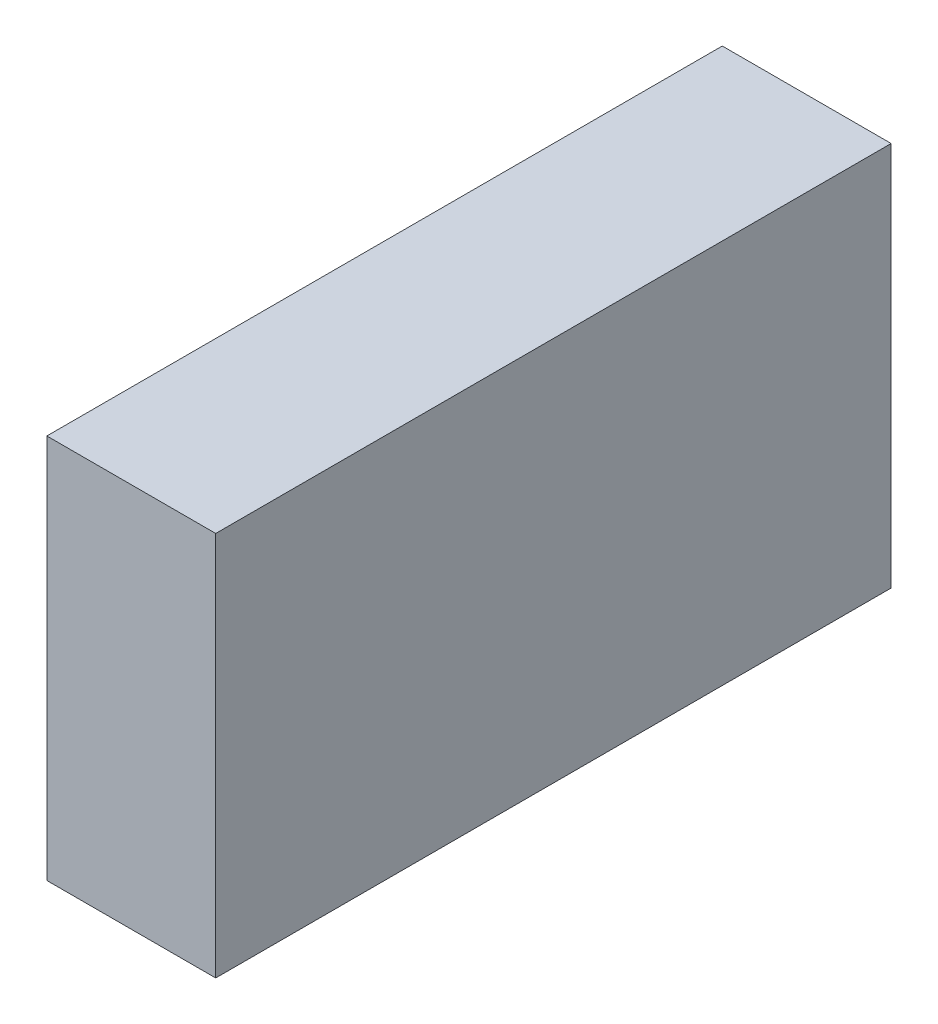
ISO-10303-21;
HEADER;
FILE_DESCRIPTION(('STEP AP214'),'2;1');
FILE_NAME('part.step','',(''),(''),'','','');
FILE_SCHEMA(('AUTOMOTIVE_DESIGN { 1 0 10303 214 1 1 1 1 }'));
ENDSEC;
DATA;
#1=APPLICATION_CONTEXT('core data for automotive mechanical design processes');
#2=APPLICATION_PROTOCOL_DEFINITION('international standard','automotive_design',2000,#1);
#3=PRODUCT_CONTEXT('',#1,'mechanical');
#4=PRODUCT('Part','Part','',(#3));
#5=PRODUCT_RELATED_PRODUCT_CATEGORY('part','',(#4));
#6=PRODUCT_DEFINITION_FORMATION('','',#4);
#7=PRODUCT_DEFINITION_CONTEXT('part definition',#1,'design');
#8=PRODUCT_DEFINITION('design','',#6,#7);
#9=PRODUCT_DEFINITION_SHAPE('','',#8);
#10=(LENGTH_UNIT() NAMED_UNIT(*) SI_UNIT(.MILLI.,.METRE.));
#11=(NAMED_UNIT(*) PLANE_ANGLE_UNIT() SI_UNIT($,.RADIAN.));
#12=(NAMED_UNIT(*) SI_UNIT($,.STERADIAN.) SOLID_ANGLE_UNIT());
#13=UNCERTAINTY_MEASURE_WITH_UNIT(LENGTH_MEASURE(1.E-05),#10,'distance_accuracy_value','');
#14=(GEOMETRIC_REPRESENTATION_CONTEXT(3) GLOBAL_UNCERTAINTY_ASSIGNED_CONTEXT((#13)) GLOBAL_UNIT_ASSIGNED_CONTEXT((#10,
#11,#12)) REPRESENTATION_CONTEXT('',''));
#15=CARTESIAN_POINT('',(0.,0.,0.));
#16=DIRECTION('',(0.,0.,1.));
#17=DIRECTION('',(1.,0.,0.));
#18=AXIS2_PLACEMENT_3D('',#15,#16,#17);
#19=CARTESIAN_POINT('',(0.,0.,200.));
#20=DIRECTION('',(1.,0.,0.));
#21=DIRECTION('',(0.,0.,-1.));
#22=AXIS2_PLACEMENT_3D('',#19,#20,#21);
#23=PLANE('',#22);
#24=DIRECTION('',(0.,-1.,0.));
#25=VECTOR('',#24,1.);
#26=CARTESIAN_POINT('',(0.,0.,0.));
#27=LINE('',#26,#25);
#28=CARTESIAN_POINT('',(0.,114.,0.));
#29=VERTEX_POINT('',#28);
#30=CARTESIAN_POINT('',(0.,0.,0.));
#31=VERTEX_POINT('',#30);
#32=EDGE_CURVE('E98',#29,#31,#27,.T.);
#33=ORIENTED_EDGE('',*,*,#32,.T.);
#34=DIRECTION('',(0.,0.,-1.));
#35=VECTOR('',#34,1.);
#36=CARTESIAN_POINT('',(0.,0.,200.));
#37=LINE('',#36,#35);
#38=CARTESIAN_POINT('',(0.,0.,200.));
#39=VERTEX_POINT('',#38);
#40=EDGE_CURVE('E11',#39,#31,#37,.T.);
#41=ORIENTED_EDGE('',*,*,#40,.F.);
#42=DIRECTION('',(0.,-1.,0.));
#43=VECTOR('',#42,1.);
#44=CARTESIAN_POINT('',(0.,0.,200.));
#45=LINE('',#44,#43);
#46=CARTESIAN_POINT('',(0.,114.,200.));
#47=VERTEX_POINT('',#46);
#48=EDGE_CURVE('E86',#47,#39,#45,.T.);
#49=ORIENTED_EDGE('',*,*,#48,.F.);
#50=DIRECTION('',(0.,0.,-1.));
#51=VECTOR('',#50,1.);
#52=CARTESIAN_POINT('',(0.,114.,200.));
#53=LINE('',#52,#51);
#54=EDGE_CURVE('E94',#47,#29,#53,.T.);
#55=ORIENTED_EDGE('',*,*,#54,.T.);
#56=EDGE_LOOP('',(#33,#41,#49,#55));
#57=FACE_BOUND('',#56,.T.);
#58=ADVANCED_FACE('F35',(#57),#23,.F.);
#59=CARTESIAN_POINT('',(0.,0.,200.));
#60=DIRECTION('',(0.,1.,0.));
#61=DIRECTION('',(0.,0.,1.));
#62=AXIS2_PLACEMENT_3D('',#59,#60,#61);
#63=PLANE('',#62);
#64=DIRECTION('',(1.,0.,0.));
#65=VECTOR('',#64,1.);
#66=CARTESIAN_POINT('',(0.,0.,0.));
#67=LINE('',#66,#65);
#68=CARTESIAN_POINT('',(50.,0.,0.));
#69=VERTEX_POINT('',#68);
#70=EDGE_CURVE('E90',#31,#69,#67,.T.);
#71=ORIENTED_EDGE('',*,*,#70,.T.);
#72=DIRECTION('',(0.,0.,-1.));
#73=VECTOR('',#72,1.);
#74=CARTESIAN_POINT('',(50.,0.,200.));
#75=LINE('',#74,#73);
#76=CARTESIAN_POINT('',(50.,0.,200.));
#77=VERTEX_POINT('',#76);
#78=EDGE_CURVE('E43',#77,#69,#75,.T.);
#79=ORIENTED_EDGE('',*,*,#78,.F.);
#80=DIRECTION('',(1.,0.,0.));
#81=VECTOR('',#80,1.);
#82=CARTESIAN_POINT('',(0.,0.,200.));
#83=LINE('',#82,#81);
#84=EDGE_CURVE('E81',#39,#77,#83,.T.);
#85=ORIENTED_EDGE('',*,*,#84,.F.);
#86=ORIENTED_EDGE('',*,*,#40,.T.);
#87=EDGE_LOOP('',(#71,#79,#85,#86));
#88=FACE_BOUND('',#87,.T.);
#89=ADVANCED_FACE('F89',(#88),#63,.F.);
#90=CARTESIAN_POINT('',(50.,0.,200.));
#91=DIRECTION('',(-1.,0.,0.));
#92=DIRECTION('',(0.,0.,1.));
#93=AXIS2_PLACEMENT_3D('',#90,#91,#92);
#94=PLANE('',#93);
#95=DIRECTION('',(0.,1.,0.));
#96=VECTOR('',#95,1.);
#97=CARTESIAN_POINT('',(50.,0.,0.));
#98=LINE('',#97,#96);
#99=CARTESIAN_POINT('',(50.,114.,0.));
#100=VERTEX_POINT('',#99);
#101=EDGE_CURVE('E68',#69,#100,#98,.T.);
#102=ORIENTED_EDGE('',*,*,#101,.T.);
#103=DIRECTION('',(0.,0.,-1.));
#104=VECTOR('',#103,1.);
#105=CARTESIAN_POINT('',(50.,114.,200.));
#106=LINE('',#105,#104);
#107=CARTESIAN_POINT('',(50.,114.,200.));
#108=VERTEX_POINT('',#107);
#109=EDGE_CURVE('E91',#108,#100,#106,.T.);
#110=ORIENTED_EDGE('',*,*,#109,.F.);
#111=DIRECTION('',(0.,1.,0.));
#112=VECTOR('',#111,1.);
#113=CARTESIAN_POINT('',(50.,0.,200.));
#114=LINE('',#113,#112);
#115=EDGE_CURVE('E84',#77,#108,#114,.T.);
#116=ORIENTED_EDGE('',*,*,#115,.F.);
#117=ORIENTED_EDGE('',*,*,#78,.T.);
#118=EDGE_LOOP('',(#102,#110,#116,#117));
#119=FACE_BOUND('',#118,.T.);
#120=ADVANCED_FACE('F92',(#119),#94,.F.);
#121=CARTESIAN_POINT('',(0.,114.,200.));
#122=DIRECTION('',(0.,-1.,0.));
#123=DIRECTION('',(0.,0.,-1.));
#124=AXIS2_PLACEMENT_3D('',#121,#122,#123);
#125=PLANE('',#124);
#126=DIRECTION('',(-1.,0.,0.));
#127=VECTOR('',#126,1.);
#128=CARTESIAN_POINT('',(0.,114.,0.));
#129=LINE('',#128,#127);
#130=EDGE_CURVE('E74',#100,#29,#129,.T.);
#131=ORIENTED_EDGE('',*,*,#130,.T.);
#132=ORIENTED_EDGE('',*,*,#54,.F.);
#133=DIRECTION('',(-1.,0.,0.));
#134=VECTOR('',#133,1.);
#135=CARTESIAN_POINT('',(0.,114.,200.));
#136=LINE('',#135,#134);
#137=EDGE_CURVE('E51',#108,#47,#136,.T.);
#138=ORIENTED_EDGE('',*,*,#137,.F.);
#139=ORIENTED_EDGE('',*,*,#109,.T.);
#140=EDGE_LOOP('',(#131,#132,#138,#139));
#141=FACE_BOUND('',#140,.T.);
#142=ADVANCED_FACE('F105',(#141),#125,.F.);
#143=CARTESIAN_POINT('',(0.,0.,200.));
#144=DIRECTION('',(0.,0.,-1.));
#145=DIRECTION('',(-1.,0.,0.));
#146=AXIS2_PLACEMENT_3D('',#143,#144,#145);
#147=PLANE('',#146);
#148=ORIENTED_EDGE('',*,*,#48,.T.);
#149=ORIENTED_EDGE('',*,*,#84,.T.);
#150=ORIENTED_EDGE('',*,*,#115,.T.);
#151=ORIENTED_EDGE('',*,*,#137,.T.);
#152=EDGE_LOOP('',(#148,#149,#150,#151));
#153=FACE_BOUND('',#152,.T.);
#154=ADVANCED_FACE('F82',(#153),#147,.F.);
#155=CARTESIAN_POINT('',(0.,0.,0.));
#156=DIRECTION('',(0.,0.,-1.));
#157=DIRECTION('',(-1.,0.,0.));
#158=AXIS2_PLACEMENT_3D('',#155,#156,#157);
#159=PLANE('',#158);
#160=ORIENTED_EDGE('',*,*,#32,.F.);
#161=ORIENTED_EDGE('',*,*,#130,.F.);
#162=ORIENTED_EDGE('',*,*,#101,.F.);
#163=ORIENTED_EDGE('',*,*,#70,.F.);
#164=EDGE_LOOP('',(#160,#161,#162,#163));
#165=FACE_BOUND('',#164,.T.);
#166=ADVANCED_FACE('F108',(#165),#159,.T.);
#167=CLOSED_SHELL('',(#58,#89,#120,#142,#154,#166));
#168=MANIFOLD_SOLID_BREP('B2',#167);
#169=ADVANCED_BREP_SHAPE_REPRESENTATION('',(#18,#168),#14);
#170=SHAPE_DEFINITION_REPRESENTATION(#9,#169);
ENDSEC;
END-ISO-10303-21;
